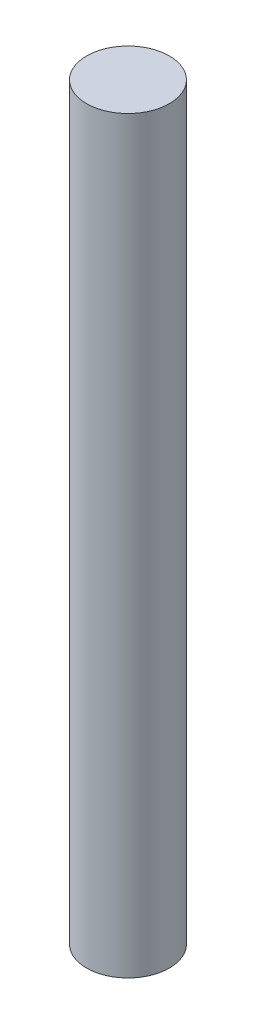
ISO-10303-21;
HEADER;
FILE_DESCRIPTION(('STEP AP214'),'2;1');
FILE_NAME('part.step','',(''),(''),'','','');
FILE_SCHEMA(('AUTOMOTIVE_DESIGN { 1 0 10303 214 1 1 1 1 }'));
ENDSEC;
DATA;
#1=APPLICATION_CONTEXT('core data for automotive mechanical design processes');
#2=APPLICATION_PROTOCOL_DEFINITION('international standard','automotive_design',2000,#1);
#3=PRODUCT_CONTEXT('',#1,'mechanical');
#4=PRODUCT('Part','Part','',(#3));
#5=PRODUCT_RELATED_PRODUCT_CATEGORY('part','',(#4));
#6=PRODUCT_DEFINITION_FORMATION('','',#4);
#7=PRODUCT_DEFINITION_CONTEXT('part definition',#1,'design');
#8=PRODUCT_DEFINITION('design','',#6,#7);
#9=PRODUCT_DEFINITION_SHAPE('','',#8);
#10=(LENGTH_UNIT() NAMED_UNIT(*) SI_UNIT(.MILLI.,.METRE.));
#11=(NAMED_UNIT(*) PLANE_ANGLE_UNIT() SI_UNIT($,.RADIAN.));
#12=(NAMED_UNIT(*) SI_UNIT($,.STERADIAN.) SOLID_ANGLE_UNIT());
#13=UNCERTAINTY_MEASURE_WITH_UNIT(LENGTH_MEASURE(1.E-05),#10,'distance_accuracy_value','');
#14=(GEOMETRIC_REPRESENTATION_CONTEXT(3) GLOBAL_UNCERTAINTY_ASSIGNED_CONTEXT((#13)) GLOBAL_UNIT_ASSIGNED_CONTEXT((#10,
#11,#12)) REPRESENTATION_CONTEXT('',''));
#15=CARTESIAN_POINT('',(0.,0.,0.));
#16=DIRECTION('',(0.,0.,1.));
#17=DIRECTION('',(1.,0.,0.));
#18=AXIS2_PLACEMENT_3D('',#15,#16,#17);
#19=CARTESIAN_POINT('',(0.,190.,0.));
#20=DIRECTION('',(0.,-1.,0.));
#21=DIRECTION('',(0.,0.,-1.));
#22=AXIS2_PLACEMENT_3D('',#19,#20,#21);
#23=CYLINDRICAL_SURFACE('',#22,10.5);
#24=CARTESIAN_POINT('',(0.,190.,0.));
#25=DIRECTION('',(0.,1.,0.));
#26=DIRECTION('',(0.,0.,1.));
#27=AXIS2_PLACEMENT_3D('',#24,#25,#26);
#28=CIRCLE('',#27,10.5);
#29=CARTESIAN_POINT('',(0.,190.,10.5));
#30=VERTEX_POINT('',#29);
#31=EDGE_CURVE('E10',#30,#30,#28,.T.);
#32=ORIENTED_EDGE('',*,*,#31,.F.);
#33=EDGE_LOOP('',(#32));
#34=FACE_BOUND('',#33,.T.);
#35=CARTESIAN_POINT('',(0.,0.,0.));
#36=DIRECTION('',(0.,1.,0.));
#37=DIRECTION('',(0.,0.,1.));
#38=AXIS2_PLACEMENT_3D('',#35,#36,#37);
#39=CIRCLE('',#38,10.5);
#40=CARTESIAN_POINT('',(0.,0.,10.5));
#41=VERTEX_POINT('',#40);
#42=EDGE_CURVE('E40',#41,#41,#39,.T.);
#43=ORIENTED_EDGE('',*,*,#42,.T.);
#44=EDGE_LOOP('',(#43));
#45=FACE_BOUND('',#44,.T.);
#46=ADVANCED_FACE('F37',(#34,#45),#23,.T.);
#47=CARTESIAN_POINT('',(0.,190.,0.));
#48=DIRECTION('',(0.,1.,0.));
#49=DIRECTION('',(0.,0.,1.));
#50=AXIS2_PLACEMENT_3D('',#47,#48,#49);
#51=PLANE('',#50);
#52=ORIENTED_EDGE('',*,*,#31,.T.);
#53=EDGE_LOOP('',(#52));
#54=FACE_BOUND('',#53,.T.);
#55=ADVANCED_FACE('F52',(#54),#51,.T.);
#56=CARTESIAN_POINT('',(0.,0.,0.));
#57=DIRECTION('',(0.,1.,0.));
#58=DIRECTION('',(0.,0.,1.));
#59=AXIS2_PLACEMENT_3D('',#56,#57,#58);
#60=PLANE('',#59);
#61=ORIENTED_EDGE('',*,*,#42,.F.);
#62=EDGE_LOOP('',(#61));
#63=FACE_BOUND('',#62,.T.);
#64=ADVANCED_FACE('F50',(#63),#60,.F.);
#65=CLOSED_SHELL('',(#46,#55,#64));
#66=MANIFOLD_SOLID_BREP('B2',#65);
#67=ADVANCED_BREP_SHAPE_REPRESENTATION('',(#18,#66),#14);
#68=SHAPE_DEFINITION_REPRESENTATION(#9,#67);
ENDSEC;
END-ISO-10303-21;
